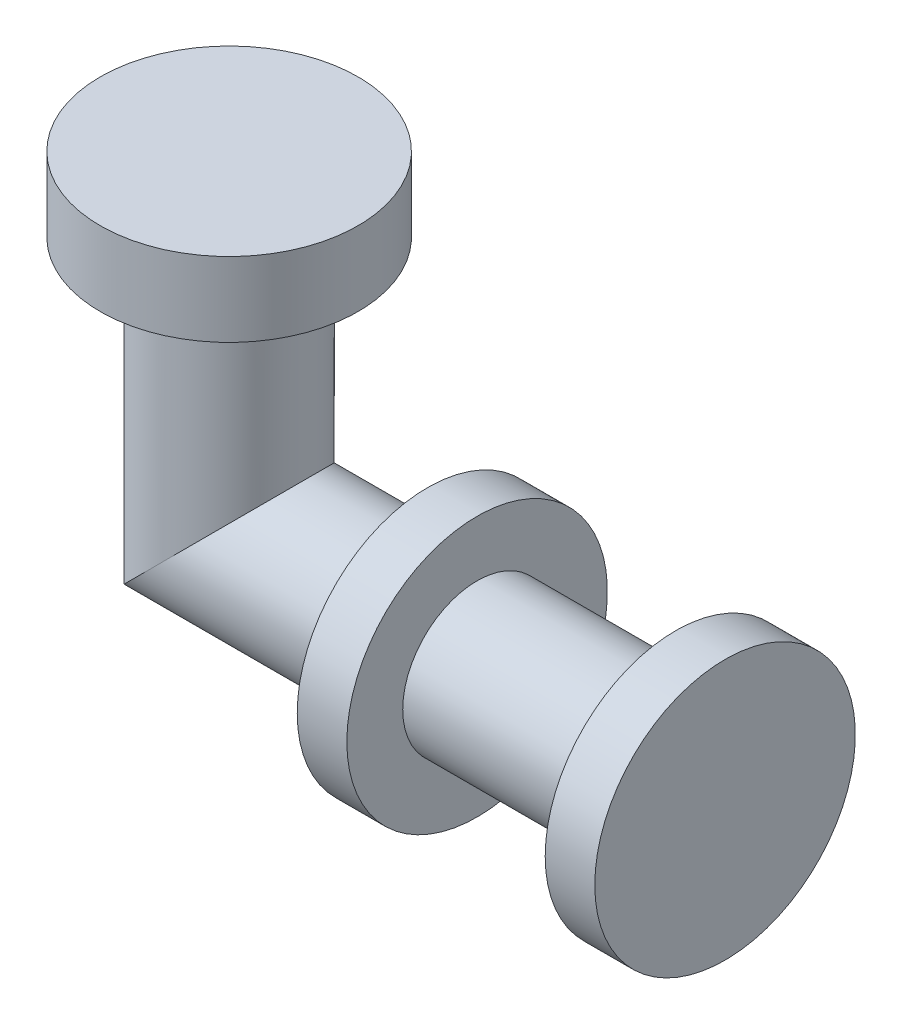
ISO-10303-21;
HEADER;
FILE_DESCRIPTION(('STEP AP214'),'2;1');
FILE_NAME('part.step','',(''),(''),'','','');
FILE_SCHEMA(('AUTOMOTIVE_DESIGN { 1 0 10303 214 1 1 1 1 }'));
ENDSEC;
DATA;
#1=APPLICATION_CONTEXT('core data for automotive mechanical design processes');
#2=APPLICATION_PROTOCOL_DEFINITION('international standard','automotive_design',2000,#1);
#3=PRODUCT_CONTEXT('',#1,'mechanical');
#4=PRODUCT('Part','Part','',(#3));
#5=PRODUCT_RELATED_PRODUCT_CATEGORY('part','',(#4));
#6=PRODUCT_DEFINITION_FORMATION('','',#4);
#7=PRODUCT_DEFINITION_CONTEXT('part definition',#1,'design');
#8=PRODUCT_DEFINITION('design','',#6,#7);
#9=PRODUCT_DEFINITION_SHAPE('','',#8);
#10=(LENGTH_UNIT() NAMED_UNIT(*) SI_UNIT(.MILLI.,.METRE.));
#11=(NAMED_UNIT(*) PLANE_ANGLE_UNIT() SI_UNIT($,.RADIAN.));
#12=(NAMED_UNIT(*) SI_UNIT($,.STERADIAN.) SOLID_ANGLE_UNIT());
#13=UNCERTAINTY_MEASURE_WITH_UNIT(LENGTH_MEASURE(1.E-05),#10,'distance_accuracy_value','');
#14=(GEOMETRIC_REPRESENTATION_CONTEXT(3) GLOBAL_UNCERTAINTY_ASSIGNED_CONTEXT((#13)) GLOBAL_UNIT_ASSIGNED_CONTEXT((#10,
#11,#12)) REPRESENTATION_CONTEXT('',''));
#15=CARTESIAN_POINT('',(0.,0.,0.));
#16=DIRECTION('',(0.,0.,1.));
#17=DIRECTION('',(1.,0.,0.));
#18=AXIS2_PLACEMENT_3D('',#15,#16,#17);
#19=CARTESIAN_POINT('',(-42.01,0.,0.));
#20=DIRECTION('',(1.,0.,0.));
#21=DIRECTION('',(0.,0.,-1.));
#22=AXIS2_PLACEMENT_3D('',#19,#20,#21);
#23=CYLINDRICAL_SURFACE('',#22,19.05);
#24=CARTESIAN_POINT('',(0.,0.,0.));
#25=DIRECTION('',(0.707106781186547,-0.707106781186548,0.));
#26=DIRECTION('',(-0.707106781186548,-0.707106781186547,0.));
#27=AXIS2_PLACEMENT_3D('',#24,#25,#26);
#28=ELLIPSE('',#27,26.9407683632075,19.05);
#29=CARTESIAN_POINT('',(-19.05,-19.05,0.));
#30=VERTEX_POINT('',#29);
#31=EDGE_CURVE('E10',#30,#30,#28,.F.);
#32=ORIENTED_EDGE('',*,*,#31,.F.);
#33=EDGE_LOOP('',(#32));
#34=FACE_BOUND('',#33,.T.);
#35=CARTESIAN_POINT('',(50.8,0.,0.));
#36=DIRECTION('',(-1.,0.,0.));
#37=DIRECTION('',(0.,0.,1.));
#38=AXIS2_PLACEMENT_3D('',#35,#36,#37);
#39=CIRCLE('',#38,19.05);
#40=CARTESIAN_POINT('',(50.8,0.,19.05));
#41=VERTEX_POINT('',#40);
#42=EDGE_CURVE('E70',#41,#41,#39,.T.);
#43=ORIENTED_EDGE('',*,*,#42,.T.);
#44=EDGE_LOOP('',(#43));
#45=FACE_BOUND('',#44,.T.);
#46=ADVANCED_FACE('F34',(#34,#45),#23,.T.);
#47=CARTESIAN_POINT('',(0.,82.55,0.));
#48=DIRECTION('',(0.,-1.,0.));
#49=DIRECTION('',(1.,0.,0.));
#50=AXIS2_PLACEMENT_3D('',#47,#48,#49);
#51=CYLINDRICAL_SURFACE('',#50,19.05);
#52=ORIENTED_EDGE('',*,*,#31,.T.);
#53=EDGE_LOOP('',(#52));
#54=FACE_BOUND('',#53,.T.);
#55=CARTESIAN_POINT('',(0.,63.5,0.));
#56=DIRECTION('',(0.,1.,0.));
#57=DIRECTION('',(-1.,0.,0.));
#58=AXIS2_PLACEMENT_3D('',#55,#56,#57);
#59=CIRCLE('',#58,19.05);
#60=CARTESIAN_POINT('',(-19.05,63.5,0.));
#61=VERTEX_POINT('',#60);
#62=EDGE_CURVE('E38',#61,#61,#59,.F.);
#63=ORIENTED_EDGE('',*,*,#62,.T.);
#64=EDGE_LOOP('',(#63));
#65=FACE_BOUND('',#64,.T.);
#66=ADVANCED_FACE('F107',(#54,#65),#51,.T.);
#67=CARTESIAN_POINT('',(0.,63.5,0.));
#68=DIRECTION('',(0.,1.,0.));
#69=DIRECTION('',(-1.,0.,0.));
#70=AXIS2_PLACEMENT_3D('',#67,#68,#69);
#71=CYLINDRICAL_SURFACE('',#70,33.02);
#72=CARTESIAN_POINT('',(0.,63.5,0.));
#73=DIRECTION('',(0.,1.,0.));
#74=DIRECTION('',(-1.,0.,0.));
#75=AXIS2_PLACEMENT_3D('',#72,#73,#74);
#76=CIRCLE('',#75,33.02);
#77=CARTESIAN_POINT('',(-33.02,63.5,0.));
#78=VERTEX_POINT('',#77);
#79=EDGE_CURVE('E45',#78,#78,#76,.T.);
#80=CARTESIAN_POINT('',(0.,82.55,0.));
#81=DIRECTION('',(0.,1.,0.));
#82=DIRECTION('',(-1.,0.,0.));
#83=AXIS2_PLACEMENT_3D('',#80,#81,#82);
#84=CIRCLE('',#83,33.02);
#85=CARTESIAN_POINT('',(-33.02,82.55,0.));
#86=VERTEX_POINT('',#85);
#87=EDGE_CURVE('E47',#86,#86,#84,.T.);
#88=CARTESIAN_POINT('',(-33.02,63.5,0.));
#89=CARTESIAN_POINT('',(-33.02,63.6984375,0.));
#90=CARTESIAN_POINT('',(-33.02,63.896875,0.));
#91=CARTESIAN_POINT('',(-33.02,64.29375,0.));
#92=CARTESIAN_POINT('',(-33.02,64.4921875,0.));
#93=CARTESIAN_POINT('',(-33.02,64.8890625,0.));
#94=CARTESIAN_POINT('',(-33.02,65.0875,0.));
#95=CARTESIAN_POINT('',(-33.02,65.484375,0.));
#96=CARTESIAN_POINT('',(-33.02,65.6828125,0.));
#97=CARTESIAN_POINT('',(-33.02,66.0796875,0.));
#98=CARTESIAN_POINT('',(-33.02,66.278125,0.));
#99=CARTESIAN_POINT('',(-33.02,66.675,0.));
#100=CARTESIAN_POINT('',(-33.02,66.8734375,0.));
#101=CARTESIAN_POINT('',(-33.02,67.2703125,0.));
#102=CARTESIAN_POINT('',(-33.02,67.46875,0.));
#103=CARTESIAN_POINT('',(-33.02,67.865625,0.));
#104=CARTESIAN_POINT('',(-33.02,68.0640625,0.));
#105=CARTESIAN_POINT('',(-33.02,68.4609375,0.));
#106=CARTESIAN_POINT('',(-33.02,68.659375,0.));
#107=CARTESIAN_POINT('',(-33.02,69.05625,0.));
#108=CARTESIAN_POINT('',(-33.02,69.2546875,0.));
#109=CARTESIAN_POINT('',(-33.02,69.6515625,0.));
#110=CARTESIAN_POINT('',(-33.02,69.85,0.));
#111=CARTESIAN_POINT('',(-33.02,70.246875,0.));
#112=CARTESIAN_POINT('',(-33.02,70.4453125,0.));
#113=CARTESIAN_POINT('',(-33.02,70.8421875,0.));
#114=CARTESIAN_POINT('',(-33.02,71.040625,0.));
#115=CARTESIAN_POINT('',(-33.02,71.4375,0.));
#116=CARTESIAN_POINT('',(-33.02,71.6359375,0.));
#117=CARTESIAN_POINT('',(-33.02,72.0328125,0.));
#118=CARTESIAN_POINT('',(-33.02,72.23125,0.));
#119=CARTESIAN_POINT('',(-33.02,72.628125,0.));
#120=CARTESIAN_POINT('',(-33.02,72.8265625,0.));
#121=CARTESIAN_POINT('',(-33.02,73.2234375,0.));
#122=CARTESIAN_POINT('',(-33.02,73.421875,0.));
#123=CARTESIAN_POINT('',(-33.02,73.81875,0.));
#124=CARTESIAN_POINT('',(-33.02,74.0171875,0.));
#125=CARTESIAN_POINT('',(-33.02,74.4140625,0.));
#126=CARTESIAN_POINT('',(-33.02,74.6125,0.));
#127=CARTESIAN_POINT('',(-33.02,75.009375,0.));
#128=CARTESIAN_POINT('',(-33.02,75.2078125,0.));
#129=CARTESIAN_POINT('',(-33.02,75.6046875,0.));
#130=CARTESIAN_POINT('',(-33.02,75.803125,0.));
#131=CARTESIAN_POINT('',(-33.02,76.2,0.));
#132=CARTESIAN_POINT('',(-33.02,76.3984375,0.));
#133=CARTESIAN_POINT('',(-33.02,76.7953125,0.));
#134=CARTESIAN_POINT('',(-33.02,76.99375,0.));
#135=CARTESIAN_POINT('',(-33.02,77.390625,0.));
#136=CARTESIAN_POINT('',(-33.02,77.5890625,0.));
#137=CARTESIAN_POINT('',(-33.02,77.9859375,0.));
#138=CARTESIAN_POINT('',(-33.02,78.184375,0.));
#139=CARTESIAN_POINT('',(-33.02,78.58125,0.));
#140=CARTESIAN_POINT('',(-33.02,78.7796875,0.));
#141=CARTESIAN_POINT('',(-33.02,79.1765625,0.));
#142=CARTESIAN_POINT('',(-33.02,79.375,0.));
#143=CARTESIAN_POINT('',(-33.02,79.771875,0.));
#144=CARTESIAN_POINT('',(-33.02,79.9703125,0.));
#145=CARTESIAN_POINT('',(-33.02,80.3671875,0.));
#146=CARTESIAN_POINT('',(-33.02,80.565625,0.));
#147=CARTESIAN_POINT('',(-33.02,80.9625,0.));
#148=CARTESIAN_POINT('',(-33.02,81.1609375,0.));
#149=CARTESIAN_POINT('',(-33.02,81.5578125,0.));
#150=CARTESIAN_POINT('',(-33.02,81.75625,0.));
#151=CARTESIAN_POINT('',(-33.02,82.153125,0.));
#152=CARTESIAN_POINT('',(-33.02,82.3515625,0.));
#153=CARTESIAN_POINT('',(-33.02,82.55,0.));
#154=B_SPLINE_CURVE_WITH_KNOTS('',3,(#88,#89,#90,#91,#92,#93,#94,#95,#96,#97,#98,#99,#100,#101,
#102,#103,#104,#105,#106,#107,#108,#109,#110,#111,#112,#113,#114,#115,#116,#117,#118,#119,#120,
#121,#122,#123,#124,#125,#126,#127,#128,#129,#130,#131,#132,#133,#134,#135,#136,#137,#138,#139,
#140,#141,#142,#143,#144,#145,#146,#147,#148,#149,#150,#151,#152,#153),.UNSPECIFIED.,.F.,.F.,(4,
2,2,2,2,2,2,2,2,2,2,2,2,2,2,2,2,2,2,2,2,2,2,2,2,2,2,2,2,2,2,2,4),(0.,0.595312499999986,
1.19062499999999,1.78593749999999,2.38124999999999,2.97656249999999,3.57187499999999,
4.16718749999999,4.76249999999999,5.35781249999999,5.95312499999999,6.54843749999999,
7.14374999999999,7.73906249999999,8.33437499999999,8.92968749999999,9.52499999999999,10.1203125,
10.715625,11.3109375,11.90625,12.5015625,13.096875,13.6921875,14.2875,14.8828125,15.478125,
16.0734375,16.66875,17.2640625,17.859375,18.4546875,19.05),.UNSPECIFIED.);
#155=EDGE_CURVE('BSEAM112',#78,#86,#154,.T.);
#156=ORIENTED_EDGE('',*,*,#79,.T.);
#157=ORIENTED_EDGE('',*,*,#87,.F.);
#158=ORIENTED_EDGE('',*,*,#155,.T.);
#159=ORIENTED_EDGE('',*,*,#155,.F.);
#160=EDGE_LOOP('',(#156,#158,#157,#159));
#161=FACE_BOUND('',#160,.T.);
#162=ADVANCED_FACE('F112',(#161),#71,.T.);
#163=CARTESIAN_POINT('',(0.,63.5,0.));
#164=DIRECTION('',(0.,1.,0.));
#165=DIRECTION('',(-1.,0.,0.));
#166=AXIS2_PLACEMENT_3D('',#163,#164,#165);
#167=PLANE('',#166);
#168=ORIENTED_EDGE('',*,*,#62,.F.);
#169=EDGE_LOOP('',(#168));
#170=FACE_BOUND('',#169,.T.);
#171=ORIENTED_EDGE('',*,*,#79,.F.);
#172=EDGE_LOOP('',(#171));
#173=FACE_BOUND('',#172,.T.);
#174=ADVANCED_FACE('F116',(#170,#173),#167,.F.);
#175=CARTESIAN_POINT('',(0.,82.55,0.));
#176=DIRECTION('',(0.,-1.,0.));
#177=DIRECTION('',(0.,0.,-1.));
#178=AXIS2_PLACEMENT_3D('',#175,#176,#177);
#179=PLANE('',#178);
#180=ORIENTED_EDGE('',*,*,#87,.T.);
#181=EDGE_LOOP('',(#180));
#182=FACE_BOUND('',#181,.T.);
#183=ADVANCED_FACE('F90',(#182),#179,.F.);
#184=CARTESIAN_POINT('',(63.5,19.05,0.));
#185=DIRECTION('',(-1.,0.,0.));
#186=DIRECTION('',(0.,0.,1.));
#187=AXIS2_PLACEMENT_3D('',#184,#185,#186);
#188=PLANE('',#187);
#189=CARTESIAN_POINT('',(63.5,0.,0.));
#190=DIRECTION('',(-1.,0.,0.));
#191=DIRECTION('',(0.,0.,1.));
#192=AXIS2_PLACEMENT_3D('',#189,#190,#191);
#193=CIRCLE('',#192,33.3634746389576);
#194=CARTESIAN_POINT('',(63.5,0.,33.3634746389576));
#195=VERTEX_POINT('',#194);
#196=EDGE_CURVE('E64',#195,#195,#193,.T.);
#197=ORIENTED_EDGE('',*,*,#196,.F.);
#198=EDGE_LOOP('',(#197));
#199=FACE_BOUND('',#198,.T.);
#200=CARTESIAN_POINT('',(63.5,0.,0.));
#201=DIRECTION('',(-1.,0.,0.));
#202=DIRECTION('',(0.,0.,1.));
#203=AXIS2_PLACEMENT_3D('',#200,#201,#202);
#204=CIRCLE('',#203,19.05);
#205=CARTESIAN_POINT('',(63.5,0.,19.05));
#206=VERTEX_POINT('',#205);
#207=EDGE_CURVE('E61',#206,#206,#204,.T.);
#208=ORIENTED_EDGE('',*,*,#207,.T.);
#209=EDGE_LOOP('',(#208));
#210=FACE_BOUND('',#209,.T.);
#211=ADVANCED_FACE('F84',(#199,#210),#188,.F.);
#212=CARTESIAN_POINT('',(0.,0.,0.));
#213=DIRECTION('',(-1.,0.,0.));
#214=DIRECTION('',(0.,0.,1.));
#215=AXIS2_PLACEMENT_3D('',#212,#213,#214);
#216=CYLINDRICAL_SURFACE('',#215,33.3634746389576);
#217=CARTESIAN_POINT('',(50.8,0.,0.));
#218=DIRECTION('',(-1.,0.,0.));
#219=DIRECTION('',(0.,0.,1.));
#220=AXIS2_PLACEMENT_3D('',#217,#218,#219);
#221=CIRCLE('',#220,33.3634746389576);
#222=CARTESIAN_POINT('',(50.8,0.,33.3634746389576));
#223=VERTEX_POINT('',#222);
#224=EDGE_CURVE('E67',#223,#223,#221,.T.);
#225=ORIENTED_EDGE('',*,*,#224,.F.);
#226=EDGE_LOOP('',(#225));
#227=FACE_BOUND('',#226,.T.);
#228=ORIENTED_EDGE('',*,*,#196,.T.);
#229=EDGE_LOOP('',(#228));
#230=FACE_BOUND('',#229,.T.);
#231=ADVANCED_FACE('F78',(#227,#230),#216,.T.);
#232=CARTESIAN_POINT('',(50.8,33.3634746389576,0.));
#233=DIRECTION('',(1.,0.,0.));
#234=DIRECTION('',(0.,0.,-1.));
#235=AXIS2_PLACEMENT_3D('',#232,#233,#234);
#236=PLANE('',#235);
#237=ORIENTED_EDGE('',*,*,#42,.F.);
#238=EDGE_LOOP('',(#237));
#239=FACE_BOUND('',#238,.T.);
#240=ORIENTED_EDGE('',*,*,#224,.T.);
#241=EDGE_LOOP('',(#240));
#242=FACE_BOUND('',#241,.T.);
#243=ADVANCED_FACE('F75',(#239,#242),#236,.F.);
#244=CARTESIAN_POINT('',(127.,0.,0.));
#245=DIRECTION('',(1.,0.,0.));
#246=DIRECTION('',(0.,0.,-1.));
#247=AXIS2_PLACEMENT_3D('',#244,#245,#246);
#248=PLANE('',#247);
#249=CARTESIAN_POINT('',(127.,0.,0.));
#250=DIRECTION('',(-1.,0.,0.));
#251=DIRECTION('',(0.,0.,1.));
#252=AXIS2_PLACEMENT_3D('',#249,#250,#251);
#253=CIRCLE('',#252,33.3634746389576);
#254=CARTESIAN_POINT('',(127.,0.,33.3634746389576));
#255=VERTEX_POINT('',#254);
#256=EDGE_CURVE('E50',#255,#255,#253,.T.);
#257=ORIENTED_EDGE('',*,*,#256,.F.);
#258=EDGE_LOOP('',(#257));
#259=FACE_BOUND('',#258,.T.);
#260=ADVANCED_FACE('F36',(#259),#248,.T.);
#261=CARTESIAN_POINT('',(0.,0.,0.));
#262=DIRECTION('',(-1.,0.,0.));
#263=DIRECTION('',(0.,0.,1.));
#264=AXIS2_PLACEMENT_3D('',#261,#262,#263);
#265=CYLINDRICAL_SURFACE('',#264,33.3634746389576);
#266=CARTESIAN_POINT('',(114.3,0.,0.));
#267=DIRECTION('',(-1.,0.,0.));
#268=DIRECTION('',(0.,0.,1.));
#269=AXIS2_PLACEMENT_3D('',#266,#267,#268);
#270=CIRCLE('',#269,33.3634746389576);
#271=CARTESIAN_POINT('',(114.3,0.,33.3634746389576));
#272=VERTEX_POINT('',#271);
#273=EDGE_CURVE('E55',#272,#272,#270,.T.);
#274=ORIENTED_EDGE('',*,*,#273,.F.);
#275=EDGE_LOOP('',(#274));
#276=FACE_BOUND('',#275,.T.);
#277=ORIENTED_EDGE('',*,*,#256,.T.);
#278=EDGE_LOOP('',(#277));
#279=FACE_BOUND('',#278,.T.);
#280=ADVANCED_FACE('F102',(#276,#279),#265,.T.);
#281=CARTESIAN_POINT('',(114.3,33.3634746389576,0.));
#282=DIRECTION('',(1.,0.,0.));
#283=DIRECTION('',(0.,0.,-1.));
#284=AXIS2_PLACEMENT_3D('',#281,#282,#283);
#285=PLANE('',#284);
#286=CARTESIAN_POINT('',(114.3,0.,0.));
#287=DIRECTION('',(-1.,0.,0.));
#288=DIRECTION('',(0.,0.,1.));
#289=AXIS2_PLACEMENT_3D('',#286,#287,#288);
#290=CIRCLE('',#289,19.05);
#291=CARTESIAN_POINT('',(114.3,0.,19.05));
#292=VERTEX_POINT('',#291);
#293=EDGE_CURVE('E58',#292,#292,#290,.T.);
#294=ORIENTED_EDGE('',*,*,#293,.F.);
#295=EDGE_LOOP('',(#294));
#296=FACE_BOUND('',#295,.T.);
#297=ORIENTED_EDGE('',*,*,#273,.T.);
#298=EDGE_LOOP('',(#297));
#299=FACE_BOUND('',#298,.T.);
#300=ADVANCED_FACE('F96',(#296,#299),#285,.F.);
#301=ORIENTED_EDGE('',*,*,#293,.T.);
#302=EDGE_LOOP('',(#301));
#303=FACE_BOUND('',#302,.T.);
#304=ORIENTED_EDGE('',*,*,#207,.F.);
#305=EDGE_LOOP('',(#304));
#306=FACE_BOUND('',#305,.T.);
#307=ADVANCED_FACE('F94',(#303,#306),#23,.T.);
#308=CLOSED_SHELL('',(#46,#66,#162,#174,#183,#211,#231,#243,#260,#280,#300,#307));
#309=MANIFOLD_SOLID_BREP('B2',#308);
#310=ADVANCED_BREP_SHAPE_REPRESENTATION('',(#18,#309),#14);
#311=SHAPE_DEFINITION_REPRESENTATION(#9,#310);
ENDSEC;
END-ISO-10303-21;
